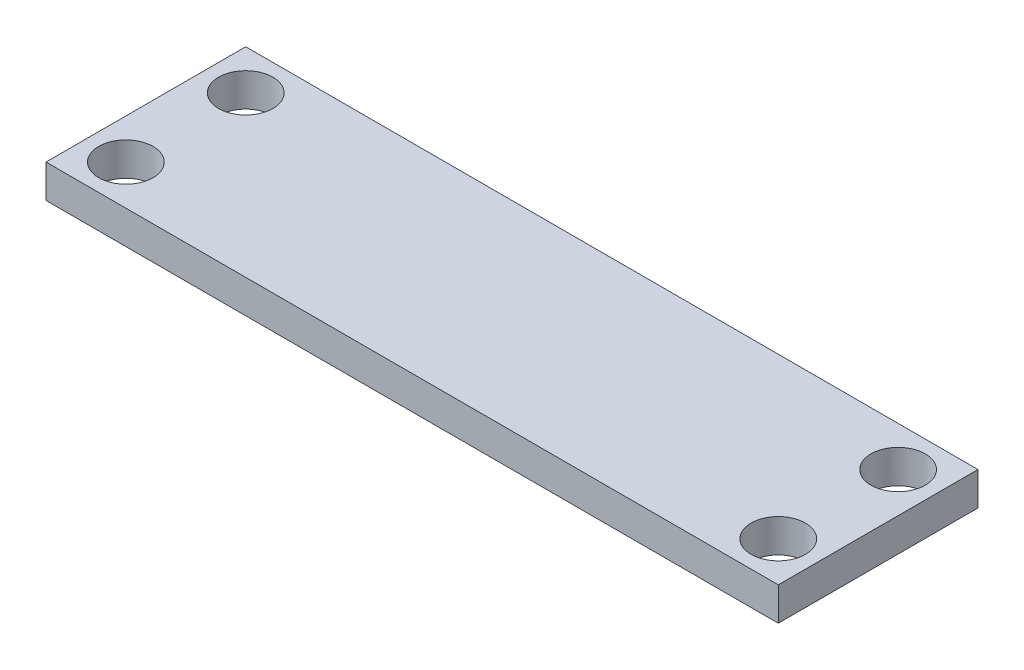
ISO-10303-21;
HEADER;
FILE_DESCRIPTION(('STEP AP214'),'2;1');
FILE_NAME('part.step','',(''),(''),'','','');
FILE_SCHEMA(('AUTOMOTIVE_DESIGN { 1 0 10303 214 1 1 1 1 }'));
ENDSEC;
DATA;
#1=APPLICATION_CONTEXT('core data for automotive mechanical design processes');
#2=APPLICATION_PROTOCOL_DEFINITION('international standard','automotive_design',2000,#1);
#3=PRODUCT_CONTEXT('',#1,'mechanical');
#4=PRODUCT('Part','Part','',(#3));
#5=PRODUCT_RELATED_PRODUCT_CATEGORY('part','',(#4));
#6=PRODUCT_DEFINITION_FORMATION('','',#4);
#7=PRODUCT_DEFINITION_CONTEXT('part definition',#1,'design');
#8=PRODUCT_DEFINITION('design','',#6,#7);
#9=PRODUCT_DEFINITION_SHAPE('','',#8);
#10=(LENGTH_UNIT() NAMED_UNIT(*) SI_UNIT(.MILLI.,.METRE.));
#11=(NAMED_UNIT(*) PLANE_ANGLE_UNIT() SI_UNIT($,.RADIAN.));
#12=(NAMED_UNIT(*) SI_UNIT($,.STERADIAN.) SOLID_ANGLE_UNIT());
#13=UNCERTAINTY_MEASURE_WITH_UNIT(LENGTH_MEASURE(1.E-05),#10,'distance_accuracy_value','');
#14=(GEOMETRIC_REPRESENTATION_CONTEXT(3) GLOBAL_UNCERTAINTY_ASSIGNED_CONTEXT((#13)) GLOBAL_UNIT_ASSIGNED_CONTEXT((#10,
#11,#12)) REPRESENTATION_CONTEXT('',''));
#15=CARTESIAN_POINT('',(0.,0.,0.));
#16=DIRECTION('',(0.,0.,1.));
#17=DIRECTION('',(1.,0.,0.));
#18=AXIS2_PLACEMENT_3D('',#15,#16,#17);
#19=CARTESIAN_POINT('',(34.925,1.5875,9.525));
#20=DIRECTION('',(-1.,0.,0.));
#21=DIRECTION('',(0.,0.,1.));
#22=AXIS2_PLACEMENT_3D('',#19,#20,#21);
#23=PLANE('',#22);
#24=DIRECTION('',(0.,0.,-1.));
#25=VECTOR('',#24,1.);
#26=CARTESIAN_POINT('',(34.925,-1.5875,9.525));
#27=LINE('',#26,#25);
#28=CARTESIAN_POINT('',(34.925,-1.5875,9.525));
#29=VERTEX_POINT('',#28);
#30=CARTESIAN_POINT('',(34.925,-1.5875,-9.525));
#31=VERTEX_POINT('',#30);
#32=EDGE_CURVE('E116',#29,#31,#27,.T.);
#33=ORIENTED_EDGE('',*,*,#32,.T.);
#34=DIRECTION('',(0.,-1.,0.));
#35=VECTOR('',#34,1.);
#36=CARTESIAN_POINT('',(34.925,1.5875,-9.525));
#37=LINE('',#36,#35);
#38=CARTESIAN_POINT('',(34.925,1.5875,-9.525));
#39=VERTEX_POINT('',#38);
#40=EDGE_CURVE('E11',#39,#31,#37,.T.);
#41=ORIENTED_EDGE('',*,*,#40,.F.);
#42=DIRECTION('',(0.,0.,-1.));
#43=VECTOR('',#42,1.);
#44=CARTESIAN_POINT('',(34.925,1.5875,9.525));
#45=LINE('',#44,#43);
#46=CARTESIAN_POINT('',(34.925,1.5875,9.525));
#47=VERTEX_POINT('',#46);
#48=EDGE_CURVE('E99',#47,#39,#45,.T.);
#49=ORIENTED_EDGE('',*,*,#48,.F.);
#50=DIRECTION('',(0.,-1.,0.));
#51=VECTOR('',#50,1.);
#52=CARTESIAN_POINT('',(34.925,1.5875,9.525));
#53=LINE('',#52,#51);
#54=EDGE_CURVE('E112',#47,#29,#53,.T.);
#55=ORIENTED_EDGE('',*,*,#54,.T.);
#56=EDGE_LOOP('',(#33,#41,#49,#55));
#57=FACE_BOUND('',#56,.T.);
#58=ADVANCED_FACE('F45',(#57),#23,.F.);
#59=CARTESIAN_POINT('',(-34.925,1.5875,-9.525));
#60=DIRECTION('',(0.,0.,1.));
#61=DIRECTION('',(1.,0.,0.));
#62=AXIS2_PLACEMENT_3D('',#59,#60,#61);
#63=PLANE('',#62);
#64=DIRECTION('',(-1.,0.,0.));
#65=VECTOR('',#64,1.);
#66=CARTESIAN_POINT('',(-34.925,-1.5875,-9.525));
#67=LINE('',#66,#65);
#68=CARTESIAN_POINT('',(-34.925,-1.5875,-9.525));
#69=VERTEX_POINT('',#68);
#70=EDGE_CURVE('E104',#31,#69,#67,.T.);
#71=ORIENTED_EDGE('',*,*,#70,.T.);
#72=DIRECTION('',(0.,-1.,0.));
#73=VECTOR('',#72,1.);
#74=CARTESIAN_POINT('',(-34.925,1.5875,-9.525));
#75=LINE('',#74,#73);
#76=CARTESIAN_POINT('',(-34.925,1.5875,-9.525));
#77=VERTEX_POINT('',#76);
#78=EDGE_CURVE('E55',#77,#69,#75,.T.);
#79=ORIENTED_EDGE('',*,*,#78,.F.);
#80=DIRECTION('',(-1.,0.,0.));
#81=VECTOR('',#80,1.);
#82=CARTESIAN_POINT('',(-34.925,1.5875,-9.525));
#83=LINE('',#82,#81);
#84=EDGE_CURVE('E94',#39,#77,#83,.T.);
#85=ORIENTED_EDGE('',*,*,#84,.F.);
#86=ORIENTED_EDGE('',*,*,#40,.T.);
#87=EDGE_LOOP('',(#71,#79,#85,#86));
#88=FACE_BOUND('',#87,.T.);
#89=ADVANCED_FACE('F103',(#88),#63,.F.);
#90=CARTESIAN_POINT('',(-34.925,1.5875,9.525));
#91=DIRECTION('',(1.,0.,0.));
#92=DIRECTION('',(0.,0.,-1.));
#93=AXIS2_PLACEMENT_3D('',#90,#91,#92);
#94=PLANE('',#93);
#95=DIRECTION('',(0.,0.,1.));
#96=VECTOR('',#95,1.);
#97=CARTESIAN_POINT('',(-34.925,-1.5875,9.525));
#98=LINE('',#97,#96);
#99=CARTESIAN_POINT('',(-34.925,-1.5875,9.525));
#100=VERTEX_POINT('',#99);
#101=EDGE_CURVE('E81',#69,#100,#98,.T.);
#102=ORIENTED_EDGE('',*,*,#101,.T.);
#103=DIRECTION('',(0.,-1.,0.));
#104=VECTOR('',#103,1.);
#105=CARTESIAN_POINT('',(-34.925,1.5875,9.525));
#106=LINE('',#105,#104);
#107=CARTESIAN_POINT('',(-34.925,1.5875,9.525));
#108=VERTEX_POINT('',#107);
#109=EDGE_CURVE('E106',#108,#100,#106,.T.);
#110=ORIENTED_EDGE('',*,*,#109,.F.);
#111=DIRECTION('',(0.,0.,1.));
#112=VECTOR('',#111,1.);
#113=CARTESIAN_POINT('',(-34.925,1.5875,9.525));
#114=LINE('',#113,#112);
#115=EDGE_CURVE('E97',#77,#108,#114,.T.);
#116=ORIENTED_EDGE('',*,*,#115,.F.);
#117=ORIENTED_EDGE('',*,*,#78,.T.);
#118=EDGE_LOOP('',(#102,#110,#116,#117));
#119=FACE_BOUND('',#118,.T.);
#120=ADVANCED_FACE('F108',(#119),#94,.F.);
#121=CARTESIAN_POINT('',(-34.925,1.5875,9.525));
#122=DIRECTION('',(0.,0.,-1.));
#123=DIRECTION('',(-1.,0.,0.));
#124=AXIS2_PLACEMENT_3D('',#121,#122,#123);
#125=PLANE('',#124);
#126=DIRECTION('',(1.,0.,0.));
#127=VECTOR('',#126,1.);
#128=CARTESIAN_POINT('',(-34.925,-1.5875,9.525));
#129=LINE('',#128,#127);
#130=EDGE_CURVE('E87',#100,#29,#129,.T.);
#131=ORIENTED_EDGE('',*,*,#130,.T.);
#132=ORIENTED_EDGE('',*,*,#54,.F.);
#133=DIRECTION('',(1.,0.,0.));
#134=VECTOR('',#133,1.);
#135=CARTESIAN_POINT('',(-34.925,1.5875,9.525));
#136=LINE('',#135,#134);
#137=EDGE_CURVE('E64',#108,#47,#136,.T.);
#138=ORIENTED_EDGE('',*,*,#137,.F.);
#139=ORIENTED_EDGE('',*,*,#109,.T.);
#140=EDGE_LOOP('',(#131,#132,#138,#139));
#141=FACE_BOUND('',#140,.T.);
#142=ADVANCED_FACE('F170',(#141),#125,.F.);
#143=CARTESIAN_POINT('',(0.,1.5875,0.));
#144=DIRECTION('',(0.,-1.,0.));
#145=DIRECTION('',(0.,0.,-1.));
#146=AXIS2_PLACEMENT_3D('',#143,#144,#145);
#147=PLANE('',#146);
#148=CARTESIAN_POINT('',(-31.115,1.5875,-5.715));
#149=DIRECTION('',(0.,1.,0.));
#150=DIRECTION('',(0.,0.,1.));
#151=AXIS2_PLACEMENT_3D('',#148,#149,#150);
#152=CIRCLE('',#151,2.5908);
#153=CARTESIAN_POINT('',(-31.115,1.5875,-3.1242));
#154=VERTEX_POINT('',#153);
#155=EDGE_CURVE('E160',#154,#154,#152,.T.);
#156=ORIENTED_EDGE('',*,*,#155,.F.);
#157=EDGE_LOOP('',(#156));
#158=FACE_BOUND('',#157,.T.);
#159=CARTESIAN_POINT('',(31.115,1.5875,5.715));
#160=DIRECTION('',(0.,1.,0.));
#161=DIRECTION('',(0.,0.,1.));
#162=AXIS2_PLACEMENT_3D('',#159,#160,#161);
#163=CIRCLE('',#162,2.5908);
#164=CARTESIAN_POINT('',(31.115,1.5875,8.30579999999999));
#165=VERTEX_POINT('',#164);
#166=EDGE_CURVE('E150',#165,#165,#163,.T.);
#167=ORIENTED_EDGE('',*,*,#166,.F.);
#168=EDGE_LOOP('',(#167));
#169=FACE_BOUND('',#168,.T.);
#170=CARTESIAN_POINT('',(31.115,1.5875,-5.715));
#171=DIRECTION('',(0.,1.,0.));
#172=DIRECTION('',(0.,0.,1.));
#173=AXIS2_PLACEMENT_3D('',#170,#171,#172);
#174=CIRCLE('',#173,2.5908);
#175=CARTESIAN_POINT('',(31.115,1.5875,-3.12420000000001));
#176=VERTEX_POINT('',#175);
#177=EDGE_CURVE('E137',#176,#176,#174,.T.);
#178=ORIENTED_EDGE('',*,*,#177,.F.);
#179=EDGE_LOOP('',(#178));
#180=FACE_BOUND('',#179,.T.);
#181=CARTESIAN_POINT('',(-31.115,1.5875,5.715));
#182=DIRECTION('',(0.,1.,0.));
#183=DIRECTION('',(0.,0.,1.));
#184=AXIS2_PLACEMENT_3D('',#181,#182,#183);
#185=CIRCLE('',#184,2.5908);
#186=CARTESIAN_POINT('',(-31.115,1.5875,8.3058));
#187=VERTEX_POINT('',#186);
#188=EDGE_CURVE('E133',#187,#187,#185,.T.);
#189=ORIENTED_EDGE('',*,*,#188,.F.);
#190=EDGE_LOOP('',(#189));
#191=FACE_BOUND('',#190,.T.);
#192=ORIENTED_EDGE('',*,*,#48,.T.);
#193=ORIENTED_EDGE('',*,*,#84,.T.);
#194=ORIENTED_EDGE('',*,*,#115,.T.);
#195=ORIENTED_EDGE('',*,*,#137,.T.);
#196=EDGE_LOOP('',(#192,#193,#194,#195));
#197=FACE_BOUND('',#196,.T.);
#198=ADVANCED_FACE('F95',(#158,#169,#180,#191,#197),#147,.F.);
#199=CARTESIAN_POINT('',(0.,-1.5875,0.));
#200=DIRECTION('',(0.,-1.,0.));
#201=DIRECTION('',(0.,0.,-1.));
#202=AXIS2_PLACEMENT_3D('',#199,#200,#201);
#203=PLANE('',#202);
#204=CARTESIAN_POINT('',(-31.115,-1.5875,-5.715));
#205=DIRECTION('',(0.,-1.,0.));
#206=DIRECTION('',(0.,0.,-1.));
#207=AXIS2_PLACEMENT_3D('',#204,#205,#206);
#208=CIRCLE('',#207,2.5908);
#209=CARTESIAN_POINT('',(-31.115,-1.5875,-8.30579999999999));
#210=VERTEX_POINT('',#209);
#211=EDGE_CURVE('E156',#210,#210,#208,.T.);
#212=ORIENTED_EDGE('',*,*,#211,.F.);
#213=EDGE_LOOP('',(#212));
#214=FACE_BOUND('',#213,.T.);
#215=CARTESIAN_POINT('',(31.115,-1.5875,5.715));
#216=DIRECTION('',(0.,-1.,0.));
#217=DIRECTION('',(0.,0.,-1.));
#218=AXIS2_PLACEMENT_3D('',#215,#216,#217);
#219=CIRCLE('',#218,2.5908);
#220=CARTESIAN_POINT('',(31.115,-1.5875,3.1242));
#221=VERTEX_POINT('',#220);
#222=EDGE_CURVE('E48',#221,#221,#219,.T.);
#223=ORIENTED_EDGE('',*,*,#222,.F.);
#224=EDGE_LOOP('',(#223));
#225=FACE_BOUND('',#224,.T.);
#226=CARTESIAN_POINT('',(31.115,-1.5875,-5.715));
#227=DIRECTION('',(0.,-1.,0.));
#228=DIRECTION('',(0.,0.,-1.));
#229=AXIS2_PLACEMENT_3D('',#226,#227,#228);
#230=CIRCLE('',#229,2.5908);
#231=CARTESIAN_POINT('',(31.115,-1.5875,-8.3058));
#232=VERTEX_POINT('',#231);
#233=EDGE_CURVE('E134',#232,#232,#230,.T.);
#234=ORIENTED_EDGE('',*,*,#233,.F.);
#235=EDGE_LOOP('',(#234));
#236=FACE_BOUND('',#235,.T.);
#237=CARTESIAN_POINT('',(-31.115,-1.5875,5.715));
#238=DIRECTION('',(0.,-1.,0.));
#239=DIRECTION('',(0.,0.,-1.));
#240=AXIS2_PLACEMENT_3D('',#237,#238,#239);
#241=CIRCLE('',#240,2.5908);
#242=CARTESIAN_POINT('',(-31.115,-1.5875,3.12420000000001));
#243=VERTEX_POINT('',#242);
#244=EDGE_CURVE('E120',#243,#243,#241,.T.);
#245=ORIENTED_EDGE('',*,*,#244,.F.);
#246=EDGE_LOOP('',(#245));
#247=FACE_BOUND('',#246,.T.);
#248=ORIENTED_EDGE('',*,*,#32,.F.);
#249=ORIENTED_EDGE('',*,*,#130,.F.);
#250=ORIENTED_EDGE('',*,*,#101,.F.);
#251=ORIENTED_EDGE('',*,*,#70,.F.);
#252=EDGE_LOOP('',(#248,#249,#250,#251));
#253=FACE_BOUND('',#252,.T.);
#254=ADVANCED_FACE('F169',(#214,#225,#236,#247,#253),#203,.T.);
#255=CARTESIAN_POINT('',(-31.115,1.5875,5.715));
#256=DIRECTION('',(0.,1.,0.));
#257=DIRECTION('',(0.,0.,1.));
#258=AXIS2_PLACEMENT_3D('',#255,#256,#257);
#259=CYLINDRICAL_SURFACE('',#258,2.5908);
#260=ORIENTED_EDGE('',*,*,#244,.T.);
#261=EDGE_LOOP('',(#260));
#262=FACE_BOUND('',#261,.T.);
#263=ORIENTED_EDGE('',*,*,#188,.T.);
#264=EDGE_LOOP('',(#263));
#265=FACE_BOUND('',#264,.T.);
#266=ADVANCED_FACE('F177',(#262,#265),#259,.F.);
#267=CARTESIAN_POINT('',(31.115,1.5875,-5.715));
#268=DIRECTION('',(0.,1.,0.));
#269=DIRECTION('',(0.,0.,1.));
#270=AXIS2_PLACEMENT_3D('',#267,#268,#269);
#271=CYLINDRICAL_SURFACE('',#270,2.5908);
#272=ORIENTED_EDGE('',*,*,#233,.T.);
#273=EDGE_LOOP('',(#272));
#274=FACE_BOUND('',#273,.T.);
#275=ORIENTED_EDGE('',*,*,#177,.T.);
#276=EDGE_LOOP('',(#275));
#277=FACE_BOUND('',#276,.T.);
#278=ADVANCED_FACE('F179',(#274,#277),#271,.F.);
#279=CARTESIAN_POINT('',(31.115,1.5875,5.715));
#280=DIRECTION('',(0.,1.,0.));
#281=DIRECTION('',(0.,0.,1.));
#282=AXIS2_PLACEMENT_3D('',#279,#280,#281);
#283=CYLINDRICAL_SURFACE('',#282,2.5908);
#284=ORIENTED_EDGE('',*,*,#222,.T.);
#285=EDGE_LOOP('',(#284));
#286=FACE_BOUND('',#285,.T.);
#287=ORIENTED_EDGE('',*,*,#166,.T.);
#288=EDGE_LOOP('',(#287));
#289=FACE_BOUND('',#288,.T.);
#290=ADVANCED_FACE('F186',(#286,#289),#283,.F.);
#291=CARTESIAN_POINT('',(-31.115,1.5875,-5.715));
#292=DIRECTION('',(0.,1.,0.));
#293=DIRECTION('',(0.,0.,1.));
#294=AXIS2_PLACEMENT_3D('',#291,#292,#293);
#295=CYLINDRICAL_SURFACE('',#294,2.5908);
#296=ORIENTED_EDGE('',*,*,#211,.T.);
#297=EDGE_LOOP('',(#296));
#298=FACE_BOUND('',#297,.T.);
#299=ORIENTED_EDGE('',*,*,#155,.T.);
#300=EDGE_LOOP('',(#299));
#301=FACE_BOUND('',#300,.T.);
#302=ADVANCED_FACE('F165',(#298,#301),#295,.F.);
#303=CLOSED_SHELL('',(#58,#89,#120,#142,#198,#254,#266,#278,#290,#302));
#304=MANIFOLD_SOLID_BREP('B2',#303);
#305=ADVANCED_BREP_SHAPE_REPRESENTATION('',(#18,#304),#14);
#306=SHAPE_DEFINITION_REPRESENTATION(#9,#305);
ENDSEC;
END-ISO-10303-21;
